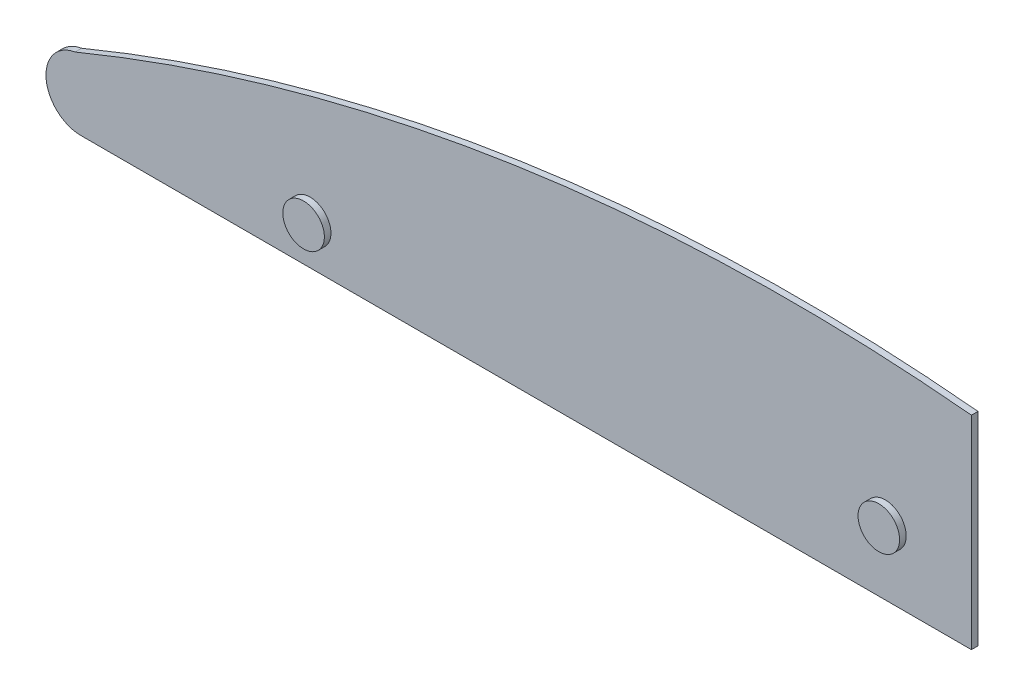
ISO-10303-21;
HEADER;
FILE_DESCRIPTION(('STEP AP214'),'2;1');
FILE_NAME('part.step','',(''),(''),'','','');
FILE_SCHEMA(('AUTOMOTIVE_DESIGN { 1 0 10303 214 1 1 1 1 }'));
ENDSEC;
DATA;
#1=APPLICATION_CONTEXT('core data for automotive mechanical design processes');
#2=APPLICATION_PROTOCOL_DEFINITION('international standard','automotive_design',2000,#1);
#3=PRODUCT_CONTEXT('',#1,'mechanical');
#4=PRODUCT('Part','Part','',(#3));
#5=PRODUCT_RELATED_PRODUCT_CATEGORY('part','',(#4));
#6=PRODUCT_DEFINITION_FORMATION('','',#4);
#7=PRODUCT_DEFINITION_CONTEXT('part definition',#1,'design');
#8=PRODUCT_DEFINITION('design','',#6,#7);
#9=PRODUCT_DEFINITION_SHAPE('','',#8);
#10=(LENGTH_UNIT() NAMED_UNIT(*) SI_UNIT(.MILLI.,.METRE.));
#11=(NAMED_UNIT(*) PLANE_ANGLE_UNIT() SI_UNIT($,.RADIAN.));
#12=(NAMED_UNIT(*) SI_UNIT($,.STERADIAN.) SOLID_ANGLE_UNIT());
#13=UNCERTAINTY_MEASURE_WITH_UNIT(LENGTH_MEASURE(1.E-05),#10,'distance_accuracy_value','');
#14=(GEOMETRIC_REPRESENTATION_CONTEXT(3) GLOBAL_UNCERTAINTY_ASSIGNED_CONTEXT((#13)) GLOBAL_UNIT_ASSIGNED_CONTEXT((#10,
#11,#12)) REPRESENTATION_CONTEXT('',''));
#15=CARTESIAN_POINT('',(0.,0.,0.));
#16=DIRECTION('',(0.,0.,1.));
#17=DIRECTION('',(1.,0.,0.));
#18=AXIS2_PLACEMENT_3D('',#15,#16,#17);
#19=CARTESIAN_POINT('',(-66.7637298766291,-682.284266483839,2.667));
#20=DIRECTION('',(0.,0.,1.));
#21=DIRECTION('',(1.,0.,0.));
#22=AXIS2_PLACEMENT_3D('',#19,#20,#21);
#23=PLANE('',#22);
#24=CARTESIAN_POINT('',(-262.437432144575,10.1041067875743,2.667));
#25=DIRECTION('',(0.,0.,1.));
#26=DIRECTION('',(1.,0.,0.));
#27=AXIS2_PLACEMENT_3D('',#24,#25,#26);
#28=CIRCLE('',#27,8.45095856524426);
#29=CARTESIAN_POINT('',(-253.986473579331,10.1041067875743,2.667));
#30=VERTEX_POINT('',#29);
#31=EDGE_CURVE('E110',#30,#30,#28,.T.);
#32=ORIENTED_EDGE('',*,*,#31,.F.);
#33=EDGE_LOOP('',(#32));
#34=FACE_BOUND('',#33,.T.);
#35=DIRECTION('',(1.,0.,0.));
#36=VECTOR('',#35,1.);
#37=CARTESIAN_POINT('',(-355.6,-6.35000000000004,2.667));
#38=LINE('',#37,#36);
#39=CARTESIAN_POINT('',(-355.6,-6.35000000000004,2.667));
#40=VERTEX_POINT('',#39);
#41=CARTESIAN_POINT('',(6.35000000000003,-6.35,2.667));
#42=VERTEX_POINT('',#41);
#43=EDGE_CURVE('E84',#40,#42,#38,.T.);
#44=ORIENTED_EDGE('',*,*,#43,.T.);
#45=DIRECTION('',(0.,1.,0.));
#46=VECTOR('',#45,1.);
#47=CARTESIAN_POINT('',(6.35000000000003,-6.35,2.667));
#48=LINE('',#47,#46);
#49=CARTESIAN_POINT('',(6.35000000000004,76.2,2.667));
#50=VERTEX_POINT('',#49);
#51=EDGE_CURVE('E79',#42,#50,#48,.T.);
#52=ORIENTED_EDGE('',*,*,#51,.T.);
#53=CARTESIAN_POINT('',(-66.7637298766291,-682.284266483839,2.667));
#54=DIRECTION('',(0.,0.,1.));
#55=DIRECTION('',(1.,0.,0.));
#56=AXIS2_PLACEMENT_3D('',#53,#54,#55);
#57=CIRCLE('',#56,762.);
#58=CARTESIAN_POINT('',(-357.978470470847,21.8733684677693,2.667));
#59=VERTEX_POINT('',#58);
#60=EDGE_CURVE('E82',#50,#59,#57,.T.);
#61=ORIENTED_EDGE('',*,*,#60,.T.);
#62=CARTESIAN_POINT('',(-355.6,7.86190476190472,2.667));
#63=DIRECTION('',(0.,0.,1.));
#64=DIRECTION('',(1.,0.,0.));
#65=AXIS2_PLACEMENT_3D('',#62,#63,#64);
#66=CIRCLE('',#65,14.2119047619048);
#67=EDGE_CURVE('E49',#59,#40,#66,.T.);
#68=ORIENTED_EDGE('',*,*,#67,.T.);
#69=EDGE_LOOP('',(#44,#52,#61,#68));
#70=FACE_BOUND('',#69,.T.);
#71=CARTESIAN_POINT('',(-28.6275785061499,20.4330561450951,2.667));
#72=DIRECTION('',(0.,0.,1.));
#73=DIRECTION('',(1.,0.,0.));
#74=AXIS2_PLACEMENT_3D('',#71,#72,#73);
#75=CIRCLE('',#74,8.45095856524427);
#76=CARTESIAN_POINT('',(-20.1766199409056,20.4330561450951,2.667));
#77=VERTEX_POINT('',#76);
#78=EDGE_CURVE('E116',#77,#77,#75,.T.);
#79=ORIENTED_EDGE('',*,*,#78,.F.);
#80=EDGE_LOOP('',(#79));
#81=FACE_BOUND('',#80,.T.);
#82=ADVANCED_FACE('F32',(#34,#70,#81),#23,.T.);
#83=CARTESIAN_POINT('',(-355.6,-6.35000000000004,2.667));
#84=DIRECTION('',(0.,1.,0.));
#85=DIRECTION('',(-1.,0.,0.));
#86=AXIS2_PLACEMENT_3D('',#83,#84,#85);
#87=PLANE('',#86);
#88=DIRECTION('',(1.,0.,0.));
#89=VECTOR('',#88,1.);
#90=CARTESIAN_POINT('',(-355.6,-6.35000000000004,0.));
#91=LINE('',#90,#89);
#92=CARTESIAN_POINT('',(-355.6,-6.35000000000004,0.));
#93=VERTEX_POINT('',#92);
#94=CARTESIAN_POINT('',(6.35000000000003,-6.35,0.));
#95=VERTEX_POINT('',#94);
#96=EDGE_CURVE('E96',#93,#95,#91,.T.);
#97=ORIENTED_EDGE('',*,*,#96,.T.);
#98=DIRECTION('',(0.,0.,-1.));
#99=VECTOR('',#98,1.);
#100=CARTESIAN_POINT('',(6.35000000000003,-6.35,2.667));
#101=LINE('',#100,#99);
#102=EDGE_CURVE('E11',#42,#95,#101,.T.);
#103=ORIENTED_EDGE('',*,*,#102,.F.);
#104=ORIENTED_EDGE('',*,*,#43,.F.);
#105=DIRECTION('',(0.,0.,-1.));
#106=VECTOR('',#105,1.);
#107=CARTESIAN_POINT('',(-355.6,-6.35000000000004,2.667));
#108=LINE('',#107,#106);
#109=EDGE_CURVE('E92',#40,#93,#108,.T.);
#110=ORIENTED_EDGE('',*,*,#109,.T.);
#111=EDGE_LOOP('',(#97,#103,#104,#110));
#112=FACE_BOUND('',#111,.T.);
#113=ADVANCED_FACE('F34',(#112),#87,.F.);
#114=CARTESIAN_POINT('',(6.35000000000003,-6.35,2.667));
#115=DIRECTION('',(-1.,0.,0.));
#116=DIRECTION('',(0.,-1.,0.));
#117=AXIS2_PLACEMENT_3D('',#114,#115,#116);
#118=PLANE('',#117);
#119=DIRECTION('',(0.,1.,0.));
#120=VECTOR('',#119,1.);
#121=CARTESIAN_POINT('',(6.35000000000003,-6.35,0.));
#122=LINE('',#121,#120);
#123=CARTESIAN_POINT('',(6.35000000000004,76.2,0.));
#124=VERTEX_POINT('',#123);
#125=EDGE_CURVE('E88',#95,#124,#122,.T.);
#126=ORIENTED_EDGE('',*,*,#125,.T.);
#127=DIRECTION('',(0.,0.,-1.));
#128=VECTOR('',#127,1.);
#129=CARTESIAN_POINT('',(6.35000000000004,76.2,2.667));
#130=LINE('',#129,#128);
#131=EDGE_CURVE('E41',#50,#124,#130,.T.);
#132=ORIENTED_EDGE('',*,*,#131,.F.);
#133=ORIENTED_EDGE('',*,*,#51,.F.);
#134=ORIENTED_EDGE('',*,*,#102,.T.);
#135=EDGE_LOOP('',(#126,#132,#133,#134));
#136=FACE_BOUND('',#135,.T.);
#137=ADVANCED_FACE('F87',(#136),#118,.F.);
#138=CARTESIAN_POINT('',(-66.7637298766291,-682.284266483839,2.667));
#139=DIRECTION('',(0.,0.,-1.));
#140=DIRECTION('',(-1.,0.,0.));
#141=AXIS2_PLACEMENT_3D('',#138,#139,#140);
#142=CYLINDRICAL_SURFACE('',#141,762.);
#143=CARTESIAN_POINT('',(-66.7637298766291,-682.284266483839,0.));
#144=DIRECTION('',(0.,0.,1.));
#145=DIRECTION('',(1.,0.,0.));
#146=AXIS2_PLACEMENT_3D('',#143,#144,#145);
#147=CIRCLE('',#146,762.);
#148=CARTESIAN_POINT('',(-357.978470470847,21.8733684677693,0.));
#149=VERTEX_POINT('',#148);
#150=EDGE_CURVE('E66',#124,#149,#147,.T.);
#151=ORIENTED_EDGE('',*,*,#150,.T.);
#152=DIRECTION('',(0.,0.,-1.));
#153=VECTOR('',#152,1.);
#154=CARTESIAN_POINT('',(-357.978470470847,21.8733684677693,2.667));
#155=LINE('',#154,#153);
#156=EDGE_CURVE('E89',#59,#149,#155,.T.);
#157=ORIENTED_EDGE('',*,*,#156,.F.);
#158=ORIENTED_EDGE('',*,*,#60,.F.);
#159=ORIENTED_EDGE('',*,*,#131,.T.);
#160=EDGE_LOOP('',(#151,#157,#158,#159));
#161=FACE_BOUND('',#160,.T.);
#162=ADVANCED_FACE('F90',(#161),#142,.T.);
#163=CARTESIAN_POINT('',(-355.6,7.86190476190472,2.667));
#164=DIRECTION('',(0.,0.,-1.));
#165=DIRECTION('',(-1.,0.,0.));
#166=AXIS2_PLACEMENT_3D('',#163,#164,#165);
#167=CYLINDRICAL_SURFACE('',#166,14.2119047619048);
#168=CARTESIAN_POINT('',(-355.6,7.86190476190472,0.));
#169=DIRECTION('',(0.,0.,1.));
#170=DIRECTION('',(1.,0.,0.));
#171=AXIS2_PLACEMENT_3D('',#168,#169,#170);
#172=CIRCLE('',#171,14.2119047619048);
#173=EDGE_CURVE('E72',#149,#93,#172,.T.);
#174=ORIENTED_EDGE('',*,*,#173,.T.);
#175=ORIENTED_EDGE('',*,*,#109,.F.);
#176=ORIENTED_EDGE('',*,*,#67,.F.);
#177=ORIENTED_EDGE('',*,*,#156,.T.);
#178=EDGE_LOOP('',(#174,#175,#176,#177));
#179=FACE_BOUND('',#178,.T.);
#180=ADVANCED_FACE('F104',(#179),#167,.T.);
#181=CARTESIAN_POINT('',(-66.7637298766291,-682.284266483839,0.));
#182=DIRECTION('',(0.,0.,1.));
#183=DIRECTION('',(1.,0.,0.));
#184=AXIS2_PLACEMENT_3D('',#181,#182,#183);
#185=PLANE('',#184);
#186=ORIENTED_EDGE('',*,*,#96,.F.);
#187=ORIENTED_EDGE('',*,*,#173,.F.);
#188=ORIENTED_EDGE('',*,*,#150,.F.);
#189=ORIENTED_EDGE('',*,*,#125,.F.);
#190=EDGE_LOOP('',(#186,#187,#188,#189));
#191=FACE_BOUND('',#190,.T.);
#192=ADVANCED_FACE('F107',(#191),#185,.F.);
#193=CARTESIAN_POINT('',(-262.437432144575,10.1041067875743,5.334));
#194=DIRECTION('',(0.,0.,-1.));
#195=DIRECTION('',(-1.,0.,0.));
#196=AXIS2_PLACEMENT_3D('',#193,#194,#195);
#197=CYLINDRICAL_SURFACE('',#196,8.45095856524426);
#198=CARTESIAN_POINT('',(-262.437432144575,10.1041067875743,5.334));
#199=DIRECTION('',(0.,0.,1.));
#200=DIRECTION('',(1.,0.,0.));
#201=AXIS2_PLACEMENT_3D('',#198,#199,#200);
#202=CIRCLE('',#201,8.45095856524426);
#203=CARTESIAN_POINT('',(-253.986473579331,10.1041067875743,5.334));
#204=VERTEX_POINT('',#203);
#205=EDGE_CURVE('E99',#204,#204,#202,.T.);
#206=ORIENTED_EDGE('',*,*,#205,.F.);
#207=EDGE_LOOP('',(#206));
#208=FACE_BOUND('',#207,.T.);
#209=ORIENTED_EDGE('',*,*,#31,.T.);
#210=EDGE_LOOP('',(#209));
#211=FACE_BOUND('',#210,.T.);
#212=ADVANCED_FACE('F139',(#208,#211),#197,.T.);
#213=CARTESIAN_POINT('',(-262.437432144575,10.1041067875743,5.334));
#214=DIRECTION('',(0.,0.,1.));
#215=DIRECTION('',(1.,0.,0.));
#216=AXIS2_PLACEMENT_3D('',#213,#214,#215);
#217=PLANE('',#216);
#218=ORIENTED_EDGE('',*,*,#205,.T.);
#219=EDGE_LOOP('',(#218));
#220=FACE_BOUND('',#219,.T.);
#221=ADVANCED_FACE('F127',(#220),#217,.T.);
#222=CARTESIAN_POINT('',(-28.6275785061499,20.4330561450951,5.334));
#223=DIRECTION('',(0.,0.,-1.));
#224=DIRECTION('',(-1.,0.,0.));
#225=AXIS2_PLACEMENT_3D('',#222,#223,#224);
#226=CYLINDRICAL_SURFACE('',#225,8.45095856524427);
#227=CARTESIAN_POINT('',(-28.6275785061499,20.4330561450951,5.334));
#228=DIRECTION('',(0.,0.,1.));
#229=DIRECTION('',(1.,0.,0.));
#230=AXIS2_PLACEMENT_3D('',#227,#228,#229);
#231=CIRCLE('',#230,8.45095856524427);
#232=CARTESIAN_POINT('',(-20.1766199409056,20.4330561450951,5.334));
#233=VERTEX_POINT('',#232);
#234=EDGE_CURVE('E113',#233,#233,#231,.T.);
#235=ORIENTED_EDGE('',*,*,#234,.F.);
#236=EDGE_LOOP('',(#235));
#237=FACE_BOUND('',#236,.T.);
#238=ORIENTED_EDGE('',*,*,#78,.T.);
#239=EDGE_LOOP('',(#238));
#240=FACE_BOUND('',#239,.T.);
#241=ADVANCED_FACE('F124',(#237,#240),#226,.T.);
#242=CARTESIAN_POINT('',(-28.6275785061499,20.4330561450951,5.334));
#243=DIRECTION('',(0.,0.,1.));
#244=DIRECTION('',(1.,0.,0.));
#245=AXIS2_PLACEMENT_3D('',#242,#243,#244);
#246=PLANE('',#245);
#247=ORIENTED_EDGE('',*,*,#234,.T.);
#248=EDGE_LOOP('',(#247));
#249=FACE_BOUND('',#248,.T.);
#250=ADVANCED_FACE('F122',(#249),#246,.T.);
#251=CLOSED_SHELL('',(#82,#113,#137,#162,#180,#192,#212,#221,#241,#250));
#252=MANIFOLD_SOLID_BREP('B2',#251);
#253=ADVANCED_BREP_SHAPE_REPRESENTATION('',(#18,#252),#14);
#254=SHAPE_DEFINITION_REPRESENTATION(#9,#253);
ENDSEC;
END-ISO-10303-21;
